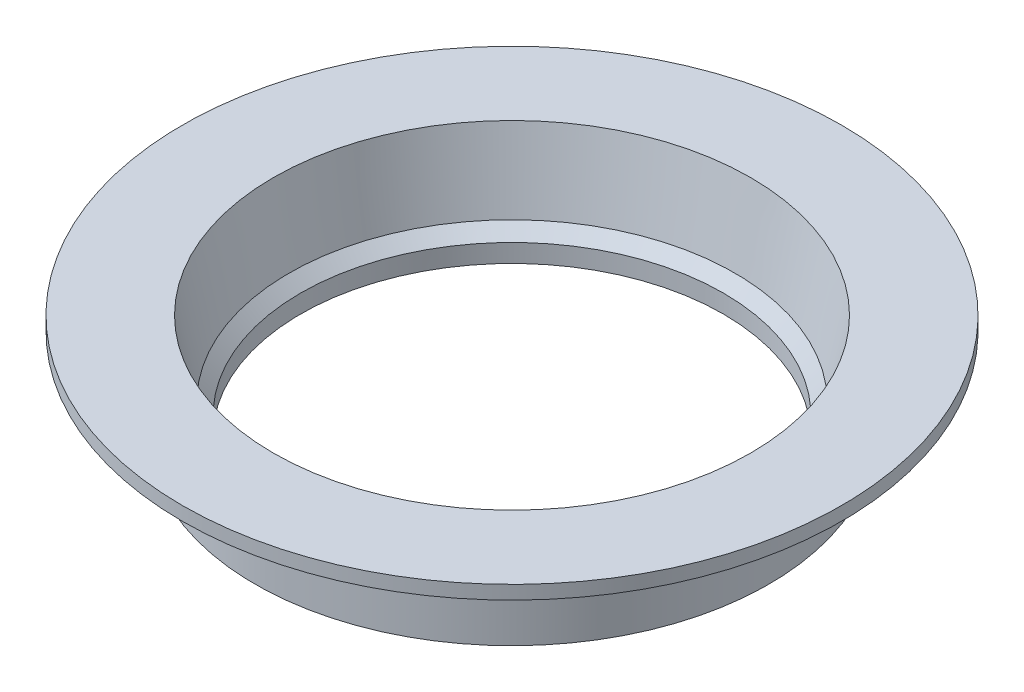
ISO-10303-21;
HEADER;
FILE_DESCRIPTION(('STEP AP214'),'2;1');
FILE_NAME('part.step','',(''),(''),'','','');
FILE_SCHEMA(('AUTOMOTIVE_DESIGN { 1 0 10303 214 1 1 1 1 }'));
ENDSEC;
DATA;
#1=APPLICATION_CONTEXT('core data for automotive mechanical design processes');
#2=APPLICATION_PROTOCOL_DEFINITION('international standard','automotive_design',2000,#1);
#3=PRODUCT_CONTEXT('',#1,'mechanical');
#4=PRODUCT('Part','Part','',(#3));
#5=PRODUCT_RELATED_PRODUCT_CATEGORY('part','',(#4));
#6=PRODUCT_DEFINITION_FORMATION('','',#4);
#7=PRODUCT_DEFINITION_CONTEXT('part definition',#1,'design');
#8=PRODUCT_DEFINITION('design','',#6,#7);
#9=PRODUCT_DEFINITION_SHAPE('','',#8);
#10=(LENGTH_UNIT() NAMED_UNIT(*) SI_UNIT(.MILLI.,.METRE.));
#11=(NAMED_UNIT(*) PLANE_ANGLE_UNIT() SI_UNIT($,.RADIAN.));
#12=(NAMED_UNIT(*) SI_UNIT($,.STERADIAN.) SOLID_ANGLE_UNIT());
#13=UNCERTAINTY_MEASURE_WITH_UNIT(LENGTH_MEASURE(1.E-05),#10,'distance_accuracy_value','');
#14=(GEOMETRIC_REPRESENTATION_CONTEXT(3) GLOBAL_UNCERTAINTY_ASSIGNED_CONTEXT((#13)) GLOBAL_UNIT_ASSIGNED_CONTEXT((#10,
#11,#12)) REPRESENTATION_CONTEXT('',''));
#15=CARTESIAN_POINT('',(0.,0.,0.));
#16=DIRECTION('',(0.,0.,1.));
#17=DIRECTION('',(1.,0.,0.));
#18=AXIS2_PLACEMENT_3D('',#15,#16,#17);
#19=CARTESIAN_POINT('',(23.25,0.,0.));
#20=DIRECTION('',(0.,-1.,0.));
#21=DIRECTION('',(0.,0.,-1.));
#22=AXIS2_PLACEMENT_3D('',#19,#20,#21);
#23=PLANE('',#22);
#24=CARTESIAN_POINT('',(0.,0.,0.));
#25=DIRECTION('',(0.,-1.,0.));
#26=DIRECTION('',(0.,0.,-1.));
#27=AXIS2_PLACEMENT_3D('',#24,#25,#26);
#28=CIRCLE('',#27,28.25);
#29=CARTESIAN_POINT('',(0.,0.,-28.25));
#30=VERTEX_POINT('',#29);
#31=EDGE_CURVE('E52',#30,#30,#28,.T.);
#32=ORIENTED_EDGE('',*,*,#31,.T.);
#33=EDGE_LOOP('',(#32));
#34=FACE_BOUND('',#33,.T.);
#35=CARTESIAN_POINT('',(0.,0.,0.));
#36=DIRECTION('',(0.,-1.,0.));
#37=DIRECTION('',(0.,0.,-1.));
#38=AXIS2_PLACEMENT_3D('',#35,#36,#37);
#39=CIRCLE('',#38,23.25);
#40=CARTESIAN_POINT('',(0.,0.,-23.25));
#41=VERTEX_POINT('',#40);
#42=EDGE_CURVE('E81',#41,#41,#39,.T.);
#43=ORIENTED_EDGE('',*,*,#42,.F.);
#44=EDGE_LOOP('',(#43));
#45=FACE_BOUND('',#44,.T.);
#46=ADVANCED_FACE('F43',(#34,#45),#23,.T.);
#47=CARTESIAN_POINT('',(0.,0.,0.));
#48=DIRECTION('',(0.,-1.,0.));
#49=DIRECTION('',(0.,0.,-1.));
#50=AXIS2_PLACEMENT_3D('',#47,#48,#49);
#51=CYLINDRICAL_SURFACE('',#50,28.25);
#52=CARTESIAN_POINT('',(0.,10.,0.));
#53=DIRECTION('',(0.,-1.,0.));
#54=DIRECTION('',(0.,0.,-1.));
#55=AXIS2_PLACEMENT_3D('',#52,#53,#54);
#56=CIRCLE('',#55,28.25);
#57=CARTESIAN_POINT('',(0.,10.,-28.25));
#58=VERTEX_POINT('',#57);
#59=EDGE_CURVE('E59',#58,#58,#56,.T.);
#60=ORIENTED_EDGE('',*,*,#59,.T.);
#61=EDGE_LOOP('',(#60));
#62=FACE_BOUND('',#61,.T.);
#63=ORIENTED_EDGE('',*,*,#31,.F.);
#64=EDGE_LOOP('',(#63));
#65=FACE_BOUND('',#64,.T.);
#66=ADVANCED_FACE('F89',(#62,#65),#51,.T.);
#67=CARTESIAN_POINT('',(28.25,10.,0.));
#68=DIRECTION('',(0.,-1.,0.));
#69=DIRECTION('',(0.,0.,-1.));
#70=AXIS2_PLACEMENT_3D('',#67,#68,#69);
#71=PLANE('',#70);
#72=CARTESIAN_POINT('',(0.,10.,0.));
#73=DIRECTION('',(0.,-1.,0.));
#74=DIRECTION('',(0.,0.,-1.));
#75=AXIS2_PLACEMENT_3D('',#72,#73,#74);
#76=CIRCLE('',#75,36.25);
#77=CARTESIAN_POINT('',(0.,10.,-36.25));
#78=VERTEX_POINT('',#77);
#79=EDGE_CURVE('E64',#78,#78,#76,.T.);
#80=ORIENTED_EDGE('',*,*,#79,.T.);
#81=EDGE_LOOP('',(#80));
#82=FACE_BOUND('',#81,.T.);
#83=ORIENTED_EDGE('',*,*,#59,.F.);
#84=EDGE_LOOP('',(#83));
#85=FACE_BOUND('',#84,.T.);
#86=ADVANCED_FACE('F93',(#82,#85),#71,.T.);
#87=CARTESIAN_POINT('',(0.,0.,0.));
#88=DIRECTION('',(0.,-1.,0.));
#89=DIRECTION('',(0.,0.,-1.));
#90=AXIS2_PLACEMENT_3D('',#87,#88,#89);
#91=CYLINDRICAL_SURFACE('',#90,36.25);
#92=CARTESIAN_POINT('',(0.,11.5,0.));
#93=DIRECTION('',(0.,-1.,0.));
#94=DIRECTION('',(0.,0.,-1.));
#95=AXIS2_PLACEMENT_3D('',#92,#93,#94);
#96=CIRCLE('',#95,36.25);
#97=CARTESIAN_POINT('',(0.,11.5,-36.25));
#98=VERTEX_POINT('',#97);
#99=EDGE_CURVE('E70',#98,#98,#96,.T.);
#100=ORIENTED_EDGE('',*,*,#99,.T.);
#101=EDGE_LOOP('',(#100));
#102=FACE_BOUND('',#101,.T.);
#103=ORIENTED_EDGE('',*,*,#79,.F.);
#104=EDGE_LOOP('',(#103));
#105=FACE_BOUND('',#104,.T.);
#106=ADVANCED_FACE('F99',(#102,#105),#91,.T.);
#107=CARTESIAN_POINT('',(36.25,11.5,0.));
#108=DIRECTION('',(0.,1.,0.));
#109=DIRECTION('',(0.,0.,1.));
#110=AXIS2_PLACEMENT_3D('',#107,#108,#109);
#111=PLANE('',#110);
#112=CARTESIAN_POINT('',(0.,11.5,0.));
#113=DIRECTION('',(0.,-1.,0.));
#114=DIRECTION('',(0.,0.,-1.));
#115=AXIS2_PLACEMENT_3D('',#112,#113,#114);
#116=CIRCLE('',#115,26.25);
#117=CARTESIAN_POINT('',(0.,11.5,-26.25));
#118=VERTEX_POINT('',#117);
#119=EDGE_CURVE('E74',#118,#118,#116,.T.);
#120=ORIENTED_EDGE('',*,*,#119,.T.);
#121=EDGE_LOOP('',(#120));
#122=FACE_BOUND('',#121,.T.);
#123=ORIENTED_EDGE('',*,*,#99,.F.);
#124=EDGE_LOOP('',(#123));
#125=FACE_BOUND('',#124,.T.);
#126=ADVANCED_FACE('F103',(#122,#125),#111,.T.);
#127=CARTESIAN_POINT('',(0.,11.5,0.));
#128=DIRECTION('',(0.,1.,0.));
#129=DIRECTION('',(0.,0.,1.));
#130=AXIS2_PLACEMENT_3D('',#127,#128,#129);
#131=CONICAL_SURFACE('',#130,26.25,0.207496226435203);
#132=CARTESIAN_POINT('',(0.,3.2666666666667,0.));
#133=DIRECTION('',(0.,1.,0.));
#134=DIRECTION('',(0.,0.,1.));
#135=AXIS2_PLACEMENT_3D('',#132,#133,#134);
#136=CIRCLE('',#135,24.5166666666667);
#137=CARTESIAN_POINT('',(0.,3.2666666666667,24.5166666666667));
#138=VERTEX_POINT('',#137);
#139=EDGE_CURVE('E10',#138,#138,#136,.F.);
#140=ORIENTED_EDGE('',*,*,#139,.T.);
#141=EDGE_LOOP('',(#140));
#142=FACE_BOUND('',#141,.T.);
#143=ORIENTED_EDGE('',*,*,#119,.F.);
#144=EDGE_LOOP('',(#143));
#145=FACE_BOUND('',#144,.T.);
#146=ADVANCED_FACE('F107',(#142,#145),#131,.F.);
#147=CARTESIAN_POINT('',(0.,0.,0.));
#148=DIRECTION('',(0.,-1.,0.));
#149=DIRECTION('',(0.,0.,-1.));
#150=AXIS2_PLACEMENT_3D('',#147,#148,#149);
#151=CYLINDRICAL_SURFACE('',#150,23.25);
#152=ORIENTED_EDGE('',*,*,#42,.T.);
#153=EDGE_LOOP('',(#152));
#154=FACE_BOUND('',#153,.T.);
#155=CARTESIAN_POINT('',(0.,2.,0.));
#156=DIRECTION('',(0.,-1.,0.));
#157=DIRECTION('',(0.,0.,-1.));
#158=AXIS2_PLACEMENT_3D('',#155,#156,#157);
#159=CIRCLE('',#158,23.25);
#160=CARTESIAN_POINT('',(0.,2.,-23.25));
#161=VERTEX_POINT('',#160);
#162=EDGE_CURVE('E78',#161,#161,#159,.T.);
#163=ORIENTED_EDGE('',*,*,#162,.F.);
#164=EDGE_LOOP('',(#163));
#165=FACE_BOUND('',#164,.T.);
#166=ADVANCED_FACE('F85',(#154,#165),#151,.F.);
#167=CARTESIAN_POINT('',(0.,3.2666666666667,0.));
#168=DIRECTION('',(0.,1.,0.));
#169=DIRECTION('',(0.,0.,1.));
#170=AXIS2_PLACEMENT_3D('',#167,#168,#169);
#171=CONICAL_SURFACE('',#170,24.5166666666667,0.785398163397444);
#172=ORIENTED_EDGE('',*,*,#162,.T.);
#173=EDGE_LOOP('',(#172));
#174=FACE_BOUND('',#173,.T.);
#175=ORIENTED_EDGE('',*,*,#139,.F.);
#176=EDGE_LOOP('',(#175));
#177=FACE_BOUND('',#176,.T.);
#178=ADVANCED_FACE('F46',(#174,#177),#171,.F.);
#179=CLOSED_SHELL('',(#46,#66,#86,#106,#126,#146,#166,#178));
#180=MANIFOLD_SOLID_BREP('B2',#179);
#181=ADVANCED_BREP_SHAPE_REPRESENTATION('',(#18,#180),#14);
#182=SHAPE_DEFINITION_REPRESENTATION(#9,#181);
ENDSEC;
END-ISO-10303-21;
